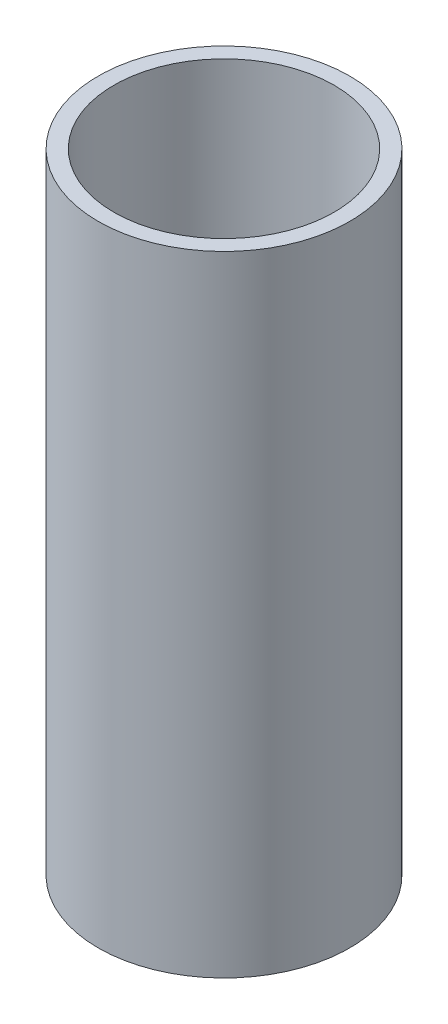
ISO-10303-21;
HEADER;
FILE_DESCRIPTION(('STEP AP214'),'2;1');
FILE_NAME('part.step','',(''),(''),'','','');
FILE_SCHEMA(('AUTOMOTIVE_DESIGN { 1 0 10303 214 1 1 1 1 }'));
ENDSEC;
DATA;
#1=APPLICATION_CONTEXT('core data for automotive mechanical design processes');
#2=APPLICATION_PROTOCOL_DEFINITION('international standard','automotive_design',2000,#1);
#3=PRODUCT_CONTEXT('',#1,'mechanical');
#4=PRODUCT('Part','Part','',(#3));
#5=PRODUCT_RELATED_PRODUCT_CATEGORY('part','',(#4));
#6=PRODUCT_DEFINITION_FORMATION('','',#4);
#7=PRODUCT_DEFINITION_CONTEXT('part definition',#1,'design');
#8=PRODUCT_DEFINITION('design','',#6,#7);
#9=PRODUCT_DEFINITION_SHAPE('','',#8);
#10=(LENGTH_UNIT() NAMED_UNIT(*) SI_UNIT(.MILLI.,.METRE.));
#11=(NAMED_UNIT(*) PLANE_ANGLE_UNIT() SI_UNIT($,.RADIAN.));
#12=(NAMED_UNIT(*) SI_UNIT($,.STERADIAN.) SOLID_ANGLE_UNIT());
#13=UNCERTAINTY_MEASURE_WITH_UNIT(LENGTH_MEASURE(1.E-05),#10,'distance_accuracy_value','');
#14=(GEOMETRIC_REPRESENTATION_CONTEXT(3) GLOBAL_UNCERTAINTY_ASSIGNED_CONTEXT((#13)) GLOBAL_UNIT_ASSIGNED_CONTEXT((#10,
#11,#12)) REPRESENTATION_CONTEXT('',''));
#15=CARTESIAN_POINT('',(0.,0.,0.));
#16=DIRECTION('',(0.,0.,1.));
#17=DIRECTION('',(1.,0.,0.));
#18=AXIS2_PLACEMENT_3D('',#15,#16,#17);
#19=CARTESIAN_POINT('',(0.,200.,0.));
#20=DIRECTION('',(0.,1.,0.));
#21=DIRECTION('',(0.,0.,1.));
#22=AXIS2_PLACEMENT_3D('',#19,#20,#21);
#23=PLANE('',#22);
#24=CARTESIAN_POINT('',(0.,200.,0.));
#25=DIRECTION('',(0.,1.,0.));
#26=DIRECTION('',(0.,0.,1.));
#27=AXIS2_PLACEMENT_3D('',#24,#25,#26);
#28=CIRCLE('',#27,40.);
#29=CARTESIAN_POINT('',(0.,200.,40.));
#30=VERTEX_POINT('',#29);
#31=EDGE_CURVE('E10',#30,#30,#28,.T.);
#32=ORIENTED_EDGE('',*,*,#31,.T.);
#33=EDGE_LOOP('',(#32));
#34=FACE_BOUND('',#33,.T.);
#35=CARTESIAN_POINT('',(0.,200.,0.));
#36=DIRECTION('',(0.,1.,0.));
#37=DIRECTION('',(0.,0.,1.));
#38=AXIS2_PLACEMENT_3D('',#35,#36,#37);
#39=CIRCLE('',#38,35.);
#40=CARTESIAN_POINT('',(0.,200.,35.));
#41=VERTEX_POINT('',#40);
#42=EDGE_CURVE('E50',#41,#41,#39,.T.);
#43=ORIENTED_EDGE('',*,*,#42,.F.);
#44=EDGE_LOOP('',(#43));
#45=FACE_BOUND('',#44,.T.);
#46=ADVANCED_FACE('F37',(#34,#45),#23,.T.);
#47=CARTESIAN_POINT('',(0.,0.,0.));
#48=DIRECTION('',(0.,1.,0.));
#49=DIRECTION('',(0.,0.,1.));
#50=AXIS2_PLACEMENT_3D('',#47,#48,#49);
#51=PLANE('',#50);
#52=CARTESIAN_POINT('',(0.,0.,0.));
#53=DIRECTION('',(0.,1.,0.));
#54=DIRECTION('',(0.,0.,1.));
#55=AXIS2_PLACEMENT_3D('',#52,#53,#54);
#56=CIRCLE('',#55,40.);
#57=CARTESIAN_POINT('',(0.,0.,40.));
#58=VERTEX_POINT('',#57);
#59=EDGE_CURVE('E41',#58,#58,#56,.T.);
#60=ORIENTED_EDGE('',*,*,#59,.F.);
#61=EDGE_LOOP('',(#60));
#62=FACE_BOUND('',#61,.T.);
#63=CARTESIAN_POINT('',(0.,0.,0.));
#64=DIRECTION('',(0.,1.,0.));
#65=DIRECTION('',(0.,0.,1.));
#66=AXIS2_PLACEMENT_3D('',#63,#64,#65);
#67=CIRCLE('',#66,35.);
#68=CARTESIAN_POINT('',(0.,0.,35.));
#69=VERTEX_POINT('',#68);
#70=EDGE_CURVE('E52',#69,#69,#67,.T.);
#71=ORIENTED_EDGE('',*,*,#70,.T.);
#72=EDGE_LOOP('',(#71));
#73=FACE_BOUND('',#72,.T.);
#74=ADVANCED_FACE('F64',(#62,#73),#51,.F.);
#75=CARTESIAN_POINT('',(0.,200.,0.));
#76=DIRECTION('',(0.,-1.,0.));
#77=DIRECTION('',(0.,0.,-1.));
#78=AXIS2_PLACEMENT_3D('',#75,#76,#77);
#79=CYLINDRICAL_SURFACE('',#78,40.);
#80=ORIENTED_EDGE('',*,*,#31,.F.);
#81=EDGE_LOOP('',(#80));
#82=FACE_BOUND('',#81,.T.);
#83=ORIENTED_EDGE('',*,*,#59,.T.);
#84=EDGE_LOOP('',(#83));
#85=FACE_BOUND('',#84,.T.);
#86=ADVANCED_FACE('F39',(#82,#85),#79,.T.);
#87=CARTESIAN_POINT('',(0.,200.,0.));
#88=DIRECTION('',(0.,-1.,0.));
#89=DIRECTION('',(0.,0.,-1.));
#90=AXIS2_PLACEMENT_3D('',#87,#88,#89);
#91=CYLINDRICAL_SURFACE('',#90,35.);
#92=ORIENTED_EDGE('',*,*,#42,.T.);
#93=EDGE_LOOP('',(#92));
#94=FACE_BOUND('',#93,.T.);
#95=ORIENTED_EDGE('',*,*,#70,.F.);
#96=EDGE_LOOP('',(#95));
#97=FACE_BOUND('',#96,.T.);
#98=ADVANCED_FACE('F60',(#94,#97),#91,.F.);
#99=CLOSED_SHELL('',(#46,#74,#86,#98));
#100=MANIFOLD_SOLID_BREP('B2',#99);
#101=ADVANCED_BREP_SHAPE_REPRESENTATION('',(#18,#100),#14);
#102=SHAPE_DEFINITION_REPRESENTATION(#9,#101);
ENDSEC;
END-ISO-10303-21;
